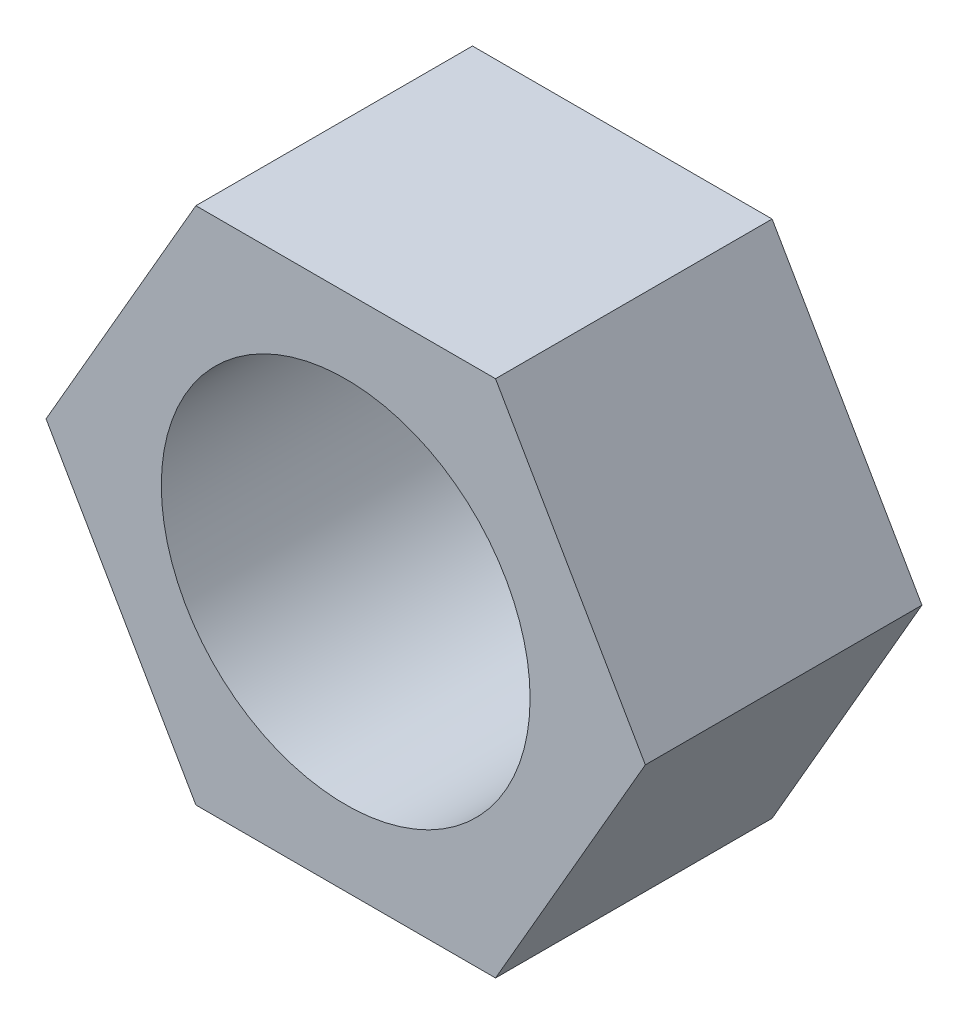
ISO-10303-21;
HEADER;
FILE_DESCRIPTION(('STEP AP214'),'2;1');
FILE_NAME('part.step','',(''),(''),'','','');
FILE_SCHEMA(('AUTOMOTIVE_DESIGN { 1 0 10303 214 1 1 1 1 }'));
ENDSEC;
DATA;
#1=APPLICATION_CONTEXT('core data for automotive mechanical design processes');
#2=APPLICATION_PROTOCOL_DEFINITION('international standard','automotive_design',2000,#1);
#3=PRODUCT_CONTEXT('',#1,'mechanical');
#4=PRODUCT('Part','Part','',(#3));
#5=PRODUCT_RELATED_PRODUCT_CATEGORY('part','',(#4));
#6=PRODUCT_DEFINITION_FORMATION('','',#4);
#7=PRODUCT_DEFINITION_CONTEXT('part definition',#1,'design');
#8=PRODUCT_DEFINITION('design','',#6,#7);
#9=PRODUCT_DEFINITION_SHAPE('','',#8);
#10=(LENGTH_UNIT() NAMED_UNIT(*) SI_UNIT(.MILLI.,.METRE.));
#11=(NAMED_UNIT(*) PLANE_ANGLE_UNIT() SI_UNIT($,.RADIAN.));
#12=(NAMED_UNIT(*) SI_UNIT($,.STERADIAN.) SOLID_ANGLE_UNIT());
#13=UNCERTAINTY_MEASURE_WITH_UNIT(LENGTH_MEASURE(1.E-05),#10,'distance_accuracy_value','');
#14=(GEOMETRIC_REPRESENTATION_CONTEXT(3) GLOBAL_UNCERTAINTY_ASSIGNED_CONTEXT((#13)) GLOBAL_UNIT_ASSIGNED_CONTEXT((#10,
#11,#12)) REPRESENTATION_CONTEXT('',''));
#15=CARTESIAN_POINT('',(0.,0.,0.));
#16=DIRECTION('',(0.,0.,1.));
#17=DIRECTION('',(1.,0.,0.));
#18=AXIS2_PLACEMENT_3D('',#15,#16,#17);
#19=CARTESIAN_POINT('',(3.25000000000006,-5.62916512459881,6.));
#20=DIRECTION('',(-0.866025403784441,0.499999999999995,0.));
#21=DIRECTION('',(-0.499999999999995,-0.866025403784442,0.));
#22=AXIS2_PLACEMENT_3D('',#19,#20,#21);
#23=PLANE('',#22);
#24=DIRECTION('',(0.499999999999995,0.866025403784441,0.));
#25=VECTOR('',#24,1.);
#26=CARTESIAN_POINT('',(3.25000000000006,-5.62916512459881,0.));
#27=LINE('',#26,#25);
#28=CARTESIAN_POINT('',(3.25000000000006,-5.62916512459881,0.));
#29=VERTEX_POINT('',#28);
#30=CARTESIAN_POINT('',(6.5,0.,0.));
#31=VERTEX_POINT('',#30);
#32=EDGE_CURVE('E123',#29,#31,#27,.T.);
#33=ORIENTED_EDGE('',*,*,#32,.T.);
#34=DIRECTION('',(0.,0.,-1.));
#35=VECTOR('',#34,1.);
#36=CARTESIAN_POINT('',(6.5,0.,6.));
#37=LINE('',#36,#35);
#38=CARTESIAN_POINT('',(6.5,0.,6.));
#39=VERTEX_POINT('',#38);
#40=EDGE_CURVE('E11',#39,#31,#37,.T.);
#41=ORIENTED_EDGE('',*,*,#40,.F.);
#42=DIRECTION('',(0.499999999999995,0.866025403784441,0.));
#43=VECTOR('',#42,1.);
#44=CARTESIAN_POINT('',(3.25000000000006,-5.62916512459881,6.));
#45=LINE('',#44,#43);
#46=CARTESIAN_POINT('',(3.25000000000006,-5.62916512459881,6.));
#47=VERTEX_POINT('',#46);
#48=EDGE_CURVE('E135',#47,#39,#45,.T.);
#49=ORIENTED_EDGE('',*,*,#48,.F.);
#50=DIRECTION('',(0.,0.,-1.));
#51=VECTOR('',#50,1.);
#52=CARTESIAN_POINT('',(3.25000000000006,-5.62916512459881,6.));
#53=LINE('',#52,#51);
#54=EDGE_CURVE('E120',#47,#29,#53,.T.);
#55=ORIENTED_EDGE('',*,*,#54,.T.);
#56=EDGE_LOOP('',(#33,#41,#49,#55));
#57=FACE_BOUND('',#56,.T.);
#58=ADVANCED_FACE('F39',(#57),#23,.F.);
#59=CARTESIAN_POINT('',(6.5,0.,6.));
#60=DIRECTION('',(-0.866025403784438,-0.500000000000001,0.));
#61=DIRECTION('',(0.500000000000001,-0.866025403784438,0.));
#62=AXIS2_PLACEMENT_3D('',#59,#60,#61);
#63=PLANE('',#62);
#64=DIRECTION('',(-0.500000000000001,0.866025403784438,0.));
#65=VECTOR('',#64,1.);
#66=CARTESIAN_POINT('',(6.5,0.,0.));
#67=LINE('',#66,#65);
#68=CARTESIAN_POINT('',(3.24999999999999,5.62916512459886,0.));
#69=VERTEX_POINT('',#68);
#70=EDGE_CURVE('E127',#31,#69,#67,.T.);
#71=ORIENTED_EDGE('',*,*,#70,.T.);
#72=DIRECTION('',(0.,0.,-1.));
#73=VECTOR('',#72,1.);
#74=CARTESIAN_POINT('',(3.24999999999999,5.62916512459886,6.));
#75=LINE('',#74,#73);
#76=CARTESIAN_POINT('',(3.24999999999999,5.62916512459886,6.));
#77=VERTEX_POINT('',#76);
#78=EDGE_CURVE('E50',#77,#69,#75,.T.);
#79=ORIENTED_EDGE('',*,*,#78,.F.);
#80=DIRECTION('',(-0.500000000000001,0.866025403784438,0.));
#81=VECTOR('',#80,1.);
#82=CARTESIAN_POINT('',(6.5,0.,6.));
#83=LINE('',#82,#81);
#84=EDGE_CURVE('E95',#39,#77,#83,.T.);
#85=ORIENTED_EDGE('',*,*,#84,.F.);
#86=ORIENTED_EDGE('',*,*,#40,.T.);
#87=EDGE_LOOP('',(#71,#79,#85,#86));
#88=FACE_BOUND('',#87,.T.);
#89=ADVANCED_FACE('F157',(#88),#63,.F.);
#90=CARTESIAN_POINT('',(3.24999999999999,5.62916512459886,6.));
#91=DIRECTION('',(0.,-1.,0.));
#92=DIRECTION('',(1.,0.,0.));
#93=AXIS2_PLACEMENT_3D('',#90,#91,#92);
#94=PLANE('',#93);
#95=DIRECTION('',(-1.,0.,0.));
#96=VECTOR('',#95,1.);
#97=CARTESIAN_POINT('',(3.24999999999999,5.62916512459886,0.));
#98=LINE('',#97,#96);
#99=CARTESIAN_POINT('',(-3.25000000000002,5.62916512459884,0.));
#100=VERTEX_POINT('',#99);
#101=EDGE_CURVE('E129',#69,#100,#98,.T.);
#102=ORIENTED_EDGE('',*,*,#101,.T.);
#103=DIRECTION('',(0.,0.,-1.));
#104=VECTOR('',#103,1.);
#105=CARTESIAN_POINT('',(-3.25000000000002,5.62916512459884,6.));
#106=LINE('',#105,#104);
#107=CARTESIAN_POINT('',(-3.25000000000002,5.62916512459884,6.));
#108=VERTEX_POINT('',#107);
#109=EDGE_CURVE('E111',#108,#100,#106,.T.);
#110=ORIENTED_EDGE('',*,*,#109,.F.);
#111=DIRECTION('',(-1.,0.,0.));
#112=VECTOR('',#111,1.);
#113=CARTESIAN_POINT('',(3.24999999999999,5.62916512459886,6.));
#114=LINE('',#113,#112);
#115=EDGE_CURVE('E104',#77,#108,#114,.T.);
#116=ORIENTED_EDGE('',*,*,#115,.F.);
#117=ORIENTED_EDGE('',*,*,#78,.T.);
#118=EDGE_LOOP('',(#102,#110,#116,#117));
#119=FACE_BOUND('',#118,.T.);
#120=ADVANCED_FACE('F139',(#119),#94,.F.);
#121=CARTESIAN_POINT('',(-3.25000000000002,5.62916512459884,6.));
#122=DIRECTION('',(0.866025403784441,-0.499999999999995,0.));
#123=DIRECTION('',(0.499999999999995,0.866025403784442,0.));
#124=AXIS2_PLACEMENT_3D('',#121,#122,#123);
#125=PLANE('',#124);
#126=DIRECTION('',(-0.499999999999995,-0.866025403784442,0.));
#127=VECTOR('',#126,1.);
#128=CARTESIAN_POINT('',(-3.25000000000002,5.62916512459884,0.));
#129=LINE('',#128,#127);
#130=CARTESIAN_POINT('',(-6.5,0.,0.));
#131=VERTEX_POINT('',#130);
#132=EDGE_CURVE('E114',#100,#131,#129,.T.);
#133=ORIENTED_EDGE('',*,*,#132,.T.);
#134=DIRECTION('',(0.,0.,-1.));
#135=VECTOR('',#134,1.);
#136=CARTESIAN_POINT('',(-6.5,0.,6.));
#137=LINE('',#136,#135);
#138=CARTESIAN_POINT('',(-6.5,0.,6.));
#139=VERTEX_POINT('',#138);
#140=EDGE_CURVE('E109',#139,#131,#137,.T.);
#141=ORIENTED_EDGE('',*,*,#140,.F.);
#142=DIRECTION('',(-0.499999999999995,-0.866025403784442,0.));
#143=VECTOR('',#142,1.);
#144=CARTESIAN_POINT('',(-3.25000000000002,5.62916512459884,6.));
#145=LINE('',#144,#143);
#146=EDGE_CURVE('E97',#108,#139,#145,.T.);
#147=ORIENTED_EDGE('',*,*,#146,.F.);
#148=ORIENTED_EDGE('',*,*,#109,.T.);
#149=EDGE_LOOP('',(#133,#141,#147,#148));
#150=FACE_BOUND('',#149,.T.);
#151=ADVANCED_FACE('F112',(#150),#125,.F.);
#152=CARTESIAN_POINT('',(-6.5,0.,6.));
#153=DIRECTION('',(0.866025403784434,0.500000000000007,0.));
#154=DIRECTION('',(-0.500000000000007,0.866025403784435,0.));
#155=AXIS2_PLACEMENT_3D('',#152,#153,#154);
#156=PLANE('',#155);
#157=DIRECTION('',(0.500000000000007,-0.866025403784435,0.));
#158=VECTOR('',#157,1.);
#159=CARTESIAN_POINT('',(-6.5,0.,0.));
#160=LINE('',#159,#158);
#161=CARTESIAN_POINT('',(-3.24999999999995,-5.62916512459888,0.));
#162=VERTEX_POINT('',#161);
#163=EDGE_CURVE('E77',#131,#162,#160,.T.);
#164=ORIENTED_EDGE('',*,*,#163,.T.);
#165=DIRECTION('',(0.,0.,-1.));
#166=VECTOR('',#165,1.);
#167=CARTESIAN_POINT('',(-3.24999999999995,-5.62916512459888,6.));
#168=LINE('',#167,#166);
#169=CARTESIAN_POINT('',(-3.24999999999995,-5.62916512459888,6.));
#170=VERTEX_POINT('',#169);
#171=EDGE_CURVE('E113',#170,#162,#168,.T.);
#172=ORIENTED_EDGE('',*,*,#171,.F.);
#173=DIRECTION('',(0.500000000000007,-0.866025403784435,0.));
#174=VECTOR('',#173,1.);
#175=CARTESIAN_POINT('',(-6.5,0.,6.));
#176=LINE('',#175,#174);
#177=EDGE_CURVE('E103',#139,#170,#176,.T.);
#178=ORIENTED_EDGE('',*,*,#177,.F.);
#179=ORIENTED_EDGE('',*,*,#140,.T.);
#180=EDGE_LOOP('',(#164,#172,#178,#179));
#181=FACE_BOUND('',#180,.T.);
#182=ADVANCED_FACE('F119',(#181),#156,.F.);
#183=CARTESIAN_POINT('',(-3.24999999999995,-5.62916512459888,6.));
#184=DIRECTION('',(0.,1.,0.));
#185=DIRECTION('',(-1.,0.,0.));
#186=AXIS2_PLACEMENT_3D('',#183,#184,#185);
#187=PLANE('',#186);
#188=DIRECTION('',(1.,0.,0.));
#189=VECTOR('',#188,1.);
#190=CARTESIAN_POINT('',(-3.24999999999995,-5.62916512459888,0.));
#191=LINE('',#190,#189);
#192=EDGE_CURVE('E82',#162,#29,#191,.T.);
#193=ORIENTED_EDGE('',*,*,#192,.T.);
#194=ORIENTED_EDGE('',*,*,#54,.F.);
#195=DIRECTION('',(1.,0.,0.));
#196=VECTOR('',#195,1.);
#197=CARTESIAN_POINT('',(-3.24999999999995,-5.62916512459888,6.));
#198=LINE('',#197,#196);
#199=EDGE_CURVE('E54',#170,#47,#198,.T.);
#200=ORIENTED_EDGE('',*,*,#199,.F.);
#201=ORIENTED_EDGE('',*,*,#171,.T.);
#202=EDGE_LOOP('',(#193,#194,#200,#201));
#203=FACE_BOUND('',#202,.T.);
#204=ADVANCED_FACE('F150',(#203),#187,.F.);
#205=CARTESIAN_POINT('',(0.,0.,6.));
#206=DIRECTION('',(0.,0.,1.));
#207=DIRECTION('',(1.,0.,0.));
#208=AXIS2_PLACEMENT_3D('',#205,#206,#207);
#209=PLANE('',#208);
#210=CARTESIAN_POINT('',(0.,0.,6.));
#211=DIRECTION('',(0.,0.,1.));
#212=DIRECTION('',(1.,0.,0.));
#213=AXIS2_PLACEMENT_3D('',#210,#211,#212);
#214=CIRCLE('',#213,4.);
#215=CARTESIAN_POINT('',(4.,0.,6.));
#216=VERTEX_POINT('',#215);
#217=EDGE_CURVE('E130',#216,#216,#214,.T.);
#218=ORIENTED_EDGE('',*,*,#217,.F.);
#219=EDGE_LOOP('',(#218));
#220=FACE_BOUND('',#219,.T.);
#221=ORIENTED_EDGE('',*,*,#48,.T.);
#222=ORIENTED_EDGE('',*,*,#84,.T.);
#223=ORIENTED_EDGE('',*,*,#115,.T.);
#224=ORIENTED_EDGE('',*,*,#146,.T.);
#225=ORIENTED_EDGE('',*,*,#177,.T.);
#226=ORIENTED_EDGE('',*,*,#199,.T.);
#227=EDGE_LOOP('',(#221,#222,#223,#224,#225,#226));
#228=FACE_BOUND('',#227,.T.);
#229=ADVANCED_FACE('F101',(#220,#228),#209,.T.);
#230=CARTESIAN_POINT('',(0.,0.,0.));
#231=DIRECTION('',(0.,0.,1.));
#232=DIRECTION('',(1.,0.,0.));
#233=AXIS2_PLACEMENT_3D('',#230,#231,#232);
#234=PLANE('',#233);
#235=CARTESIAN_POINT('',(0.,0.,0.));
#236=DIRECTION('',(0.,0.,1.));
#237=DIRECTION('',(1.,0.,0.));
#238=AXIS2_PLACEMENT_3D('',#235,#236,#237);
#239=CIRCLE('',#238,4.);
#240=CARTESIAN_POINT('',(4.,0.,0.));
#241=VERTEX_POINT('',#240);
#242=EDGE_CURVE('E214',#241,#241,#239,.T.);
#243=ORIENTED_EDGE('',*,*,#242,.T.);
#244=EDGE_LOOP('',(#243));
#245=FACE_BOUND('',#244,.T.);
#246=ORIENTED_EDGE('',*,*,#32,.F.);
#247=ORIENTED_EDGE('',*,*,#192,.F.);
#248=ORIENTED_EDGE('',*,*,#163,.F.);
#249=ORIENTED_EDGE('',*,*,#132,.F.);
#250=ORIENTED_EDGE('',*,*,#101,.F.);
#251=ORIENTED_EDGE('',*,*,#70,.F.);
#252=EDGE_LOOP('',(#246,#247,#248,#249,#250,#251));
#253=FACE_BOUND('',#252,.T.);
#254=ADVANCED_FACE('F141',(#245,#253),#234,.F.);
#255=CARTESIAN_POINT('',(0.,0.,6.));
#256=DIRECTION('',(0.,0.,-1.));
#257=DIRECTION('',(-1.,0.,0.));
#258=AXIS2_PLACEMENT_3D('',#255,#256,#257);
#259=CYLINDRICAL_SURFACE('',#258,4.);
#260=ORIENTED_EDGE('',*,*,#217,.T.);
#261=EDGE_LOOP('',(#260));
#262=FACE_BOUND('',#261,.T.);
#263=ORIENTED_EDGE('',*,*,#242,.F.);
#264=EDGE_LOOP('',(#263));
#265=FACE_BOUND('',#264,.T.);
#266=ADVANCED_FACE('F196',(#262,#265),#259,.F.);
#267=CLOSED_SHELL('',(#58,#89,#120,#151,#182,#204,#229,#254,#266));
#268=MANIFOLD_SOLID_BREP('B2',#267);
#269=ADVANCED_BREP_SHAPE_REPRESENTATION('',(#18,#268),#14);
#270=SHAPE_DEFINITION_REPRESENTATION(#9,#269);
ENDSEC;
END-ISO-10303-21;
